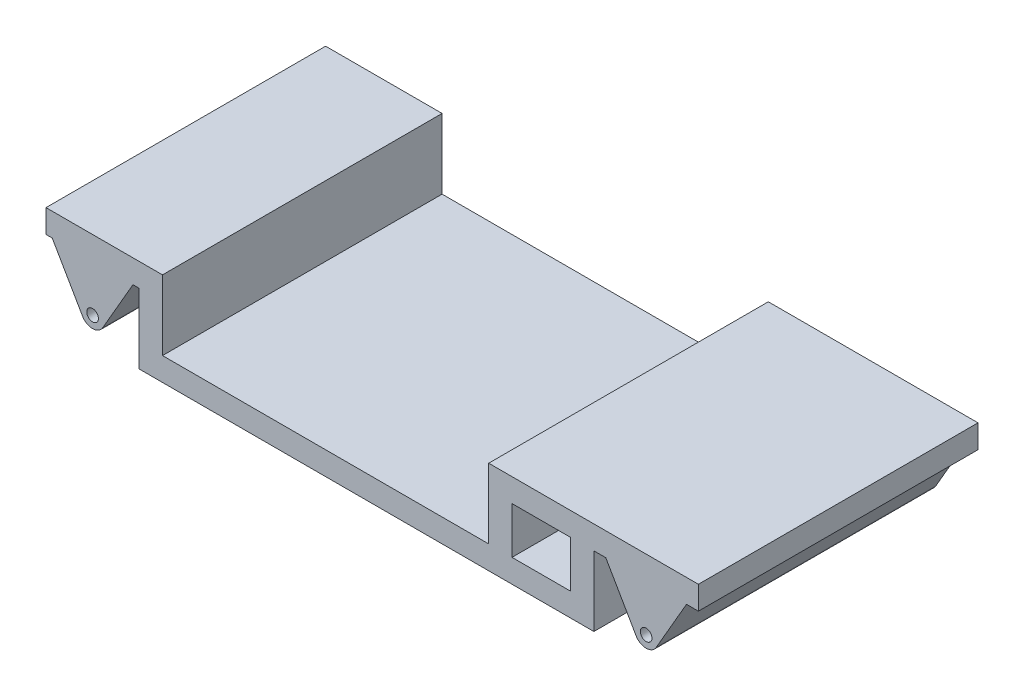
ISO-10303-21;
HEADER;
FILE_DESCRIPTION(('STEP AP214'),'2;1');
FILE_NAME('part.step','',(''),(''),'','','');
FILE_SCHEMA(('AUTOMOTIVE_DESIGN { 1 0 10303 214 1 1 1 1 }'));
ENDSEC;
DATA;
#1=APPLICATION_CONTEXT('core data for automotive mechanical design processes');
#2=APPLICATION_PROTOCOL_DEFINITION('international standard','automotive_design',2000,#1);
#3=PRODUCT_CONTEXT('',#1,'mechanical');
#4=PRODUCT('Part','Part','',(#3));
#5=PRODUCT_RELATED_PRODUCT_CATEGORY('part','',(#4));
#6=PRODUCT_DEFINITION_FORMATION('','',#4);
#7=PRODUCT_DEFINITION_CONTEXT('part definition',#1,'design');
#8=PRODUCT_DEFINITION('design','',#6,#7);
#9=PRODUCT_DEFINITION_SHAPE('','',#8);
#10=(LENGTH_UNIT() NAMED_UNIT(*) SI_UNIT(.MILLI.,.METRE.));
#11=(NAMED_UNIT(*) PLANE_ANGLE_UNIT() SI_UNIT($,.RADIAN.));
#12=(NAMED_UNIT(*) SI_UNIT($,.STERADIAN.) SOLID_ANGLE_UNIT());
#13=UNCERTAINTY_MEASURE_WITH_UNIT(LENGTH_MEASURE(1.E-05),#10,'distance_accuracy_value','');
#14=(GEOMETRIC_REPRESENTATION_CONTEXT(3) GLOBAL_UNCERTAINTY_ASSIGNED_CONTEXT((#13)) GLOBAL_UNIT_ASSIGNED_CONTEXT((#10,
#11,#12)) REPRESENTATION_CONTEXT('',''));
#15=CARTESIAN_POINT('',(0.,0.,0.));
#16=DIRECTION('',(0.,0.,1.));
#17=DIRECTION('',(1.,0.,0.));
#18=AXIS2_PLACEMENT_3D('',#15,#16,#17);
#19=CARTESIAN_POINT('',(900.,624.902446895675,-1200.));
#20=DIRECTION('',(0.,1.,0.));
#21=DIRECTION('',(0.,0.,1.));
#22=AXIS2_PLACEMENT_3D('',#19,#20,#21);
#23=PLANE('',#22);
#24=DIRECTION('',(-1.,0.,0.));
#25=VECTOR('',#24,1.);
#26=CARTESIAN_POINT('',(900.,624.902446895675,0.));
#27=LINE('',#26,#25);
#28=CARTESIAN_POINT('',(1800.,624.902446895675,0.));
#29=VERTEX_POINT('',#28);
#30=CARTESIAN_POINT('',(900.,624.902446895675,0.));
#31=VERTEX_POINT('',#30);
#32=EDGE_CURVE('E233',#29,#31,#27,.T.);
#33=ORIENTED_EDGE('',*,*,#32,.F.);
#34=DIRECTION('',(0.,0.,1.));
#35=VECTOR('',#34,1.);
#36=CARTESIAN_POINT('',(1800.,624.902446895675,-1200.));
#37=LINE('',#36,#35);
#38=CARTESIAN_POINT('',(1800.,624.902446895675,-1200.));
#39=VERTEX_POINT('',#38);
#40=EDGE_CURVE('E11',#39,#29,#37,.T.);
#41=ORIENTED_EDGE('',*,*,#40,.F.);
#42=DIRECTION('',(-1.,0.,0.));
#43=VECTOR('',#42,1.);
#44=CARTESIAN_POINT('',(900.,624.902446895675,-1200.));
#45=LINE('',#44,#43);
#46=CARTESIAN_POINT('',(900.,624.902446895675,-1200.));
#47=VERTEX_POINT('',#46);
#48=EDGE_CURVE('E237',#39,#47,#45,.T.);
#49=ORIENTED_EDGE('',*,*,#48,.T.);
#50=DIRECTION('',(0.,0.,1.));
#51=VECTOR('',#50,1.);
#52=CARTESIAN_POINT('',(900.,624.902446895675,-1200.));
#53=LINE('',#52,#51);
#54=EDGE_CURVE('E38',#47,#31,#53,.T.);
#55=ORIENTED_EDGE('',*,*,#54,.T.);
#56=EDGE_LOOP('',(#33,#41,#49,#55));
#57=FACE_BOUND('',#56,.T.);
#58=ADVANCED_FACE('F35',(#57),#23,.T.);
#59=CARTESIAN_POINT('',(1800.,524.902446895675,-1200.));
#60=DIRECTION('',(1.,0.,0.));
#61=DIRECTION('',(0.,0.,-1.));
#62=AXIS2_PLACEMENT_3D('',#59,#60,#61);
#63=PLANE('',#62);
#64=DIRECTION('',(0.,1.,0.));
#65=VECTOR('',#64,1.);
#66=CARTESIAN_POINT('',(1800.,524.902446895675,0.));
#67=LINE('',#66,#65);
#68=CARTESIAN_POINT('',(1800.,524.902446895675,0.));
#69=VERTEX_POINT('',#68);
#70=EDGE_CURVE('E241',#69,#29,#67,.T.);
#71=ORIENTED_EDGE('',*,*,#70,.F.);
#72=DIRECTION('',(0.,0.,1.));
#73=VECTOR('',#72,1.);
#74=CARTESIAN_POINT('',(1800.,524.902446895675,-1200.));
#75=LINE('',#74,#73);
#76=CARTESIAN_POINT('',(1800.,524.902446895675,-1200.));
#77=VERTEX_POINT('',#76);
#78=EDGE_CURVE('E43',#77,#69,#75,.T.);
#79=ORIENTED_EDGE('',*,*,#78,.F.);
#80=DIRECTION('',(0.,1.,0.));
#81=VECTOR('',#80,1.);
#82=CARTESIAN_POINT('',(1800.,524.902446895675,-1200.));
#83=LINE('',#82,#81);
#84=EDGE_CURVE('E294',#77,#39,#83,.T.);
#85=ORIENTED_EDGE('',*,*,#84,.T.);
#86=ORIENTED_EDGE('',*,*,#40,.T.);
#87=EDGE_LOOP('',(#71,#79,#85,#86));
#88=FACE_BOUND('',#87,.T.);
#89=ADVANCED_FACE('F402',(#88),#63,.T.);
#90=CARTESIAN_POINT('',(1800.,524.902446895675,-1200.));
#91=DIRECTION('',(0.,-1.,0.));
#92=DIRECTION('',(0.,0.,-1.));
#93=AXIS2_PLACEMENT_3D('',#90,#91,#92);
#94=PLANE('',#93);
#95=DIRECTION('',(1.,0.,0.));
#96=VECTOR('',#95,1.);
#97=CARTESIAN_POINT('',(1800.,524.902446895675,0.));
#98=LINE('',#97,#96);
#99=CARTESIAN_POINT('',(1748.91726134456,524.902446895675,0.));
#100=VERTEX_POINT('',#99);
#101=EDGE_CURVE('E350',#100,#69,#98,.T.);
#102=ORIENTED_EDGE('',*,*,#101,.F.);
#103=DIRECTION('',(0.,0.,1.));
#104=VECTOR('',#103,1.);
#105=CARTESIAN_POINT('',(1748.91726134456,524.902446895675,-1200.));
#106=LINE('',#105,#104);
#107=CARTESIAN_POINT('',(1748.91726134456,524.902446895675,-1200.));
#108=VERTEX_POINT('',#107);
#109=EDGE_CURVE('E356',#108,#100,#106,.T.);
#110=ORIENTED_EDGE('',*,*,#109,.F.);
#111=DIRECTION('',(1.,0.,0.));
#112=VECTOR('',#111,1.);
#113=CARTESIAN_POINT('',(1800.,524.902446895675,-1200.));
#114=LINE('',#113,#112);
#115=EDGE_CURVE('E291',#108,#77,#114,.T.);
#116=ORIENTED_EDGE('',*,*,#115,.T.);
#117=ORIENTED_EDGE('',*,*,#78,.T.);
#118=EDGE_LOOP('',(#102,#110,#116,#117));
#119=FACE_BOUND('',#118,.T.);
#120=ADVANCED_FACE('F469',(#119),#94,.T.);
#121=CARTESIAN_POINT('',(1619.01345077689,299.902446895675,-1200.));
#122=DIRECTION('',(0.866025403784439,-0.5,0.));
#123=DIRECTION('',(0.5,0.866025403784439,0.));
#124=AXIS2_PLACEMENT_3D('',#121,#122,#123);
#125=PLANE('',#124);
#126=DIRECTION('',(0.5,0.866025403784439,0.));
#127=VECTOR('',#126,1.);
#128=CARTESIAN_POINT('',(1619.01345077689,299.902446895675,0.));
#129=LINE('',#128,#127);
#130=CARTESIAN_POINT('',(1619.01345077689,299.902446895675,0.));
#131=VERTEX_POINT('',#130);
#132=EDGE_CURVE('E347',#131,#100,#129,.T.);
#133=ORIENTED_EDGE('',*,*,#132,.F.);
#134=DIRECTION('',(0.,0.,1.));
#135=VECTOR('',#134,1.);
#136=CARTESIAN_POINT('',(1619.01345077689,299.902446895675,-1200.));
#137=LINE('',#136,#135);
#138=CARTESIAN_POINT('',(1619.01345077689,299.902446895675,-1200.));
#139=VERTEX_POINT('',#138);
#140=EDGE_CURVE('E358',#139,#131,#137,.T.);
#141=ORIENTED_EDGE('',*,*,#140,.F.);
#142=DIRECTION('',(0.5,0.866025403784439,0.));
#143=VECTOR('',#142,1.);
#144=CARTESIAN_POINT('',(1619.01345077689,299.902446895675,-1200.));
#145=LINE('',#144,#143);
#146=EDGE_CURVE('E288',#139,#108,#145,.T.);
#147=ORIENTED_EDGE('',*,*,#146,.T.);
#148=ORIENTED_EDGE('',*,*,#109,.T.);
#149=EDGE_LOOP('',(#133,#141,#147,#148));
#150=FACE_BOUND('',#149,.T.);
#151=ADVANCED_FACE('F467',(#150),#125,.T.);
#152=CARTESIAN_POINT('',(1575.71218058767,324.902446895675,-1200.));
#153=DIRECTION('',(0.,0.,1.));
#154=DIRECTION('',(1.,0.,0.));
#155=AXIS2_PLACEMENT_3D('',#152,#153,#154);
#156=CYLINDRICAL_SURFACE('',#155,50.0000000000002);
#157=CARTESIAN_POINT('',(1575.71218058767,324.902446895675,0.));
#158=DIRECTION('',(0.,0.,1.));
#159=DIRECTION('',(1.,0.,0.));
#160=AXIS2_PLACEMENT_3D('',#157,#158,#159);
#161=CIRCLE('',#160,50.0000000000002);
#162=CARTESIAN_POINT('',(1532.41091039845,299.902446895675,0.));
#163=VERTEX_POINT('',#162);
#164=EDGE_CURVE('E344',#163,#131,#161,.T.);
#165=ORIENTED_EDGE('',*,*,#164,.F.);
#166=DIRECTION('',(0.,0.,1.));
#167=VECTOR('',#166,1.);
#168=CARTESIAN_POINT('',(1532.41091039845,299.902446895675,-1200.));
#169=LINE('',#168,#167);
#170=CARTESIAN_POINT('',(1532.41091039845,299.902446895675,-1200.));
#171=VERTEX_POINT('',#170);
#172=EDGE_CURVE('E360',#171,#163,#169,.T.);
#173=ORIENTED_EDGE('',*,*,#172,.F.);
#174=CARTESIAN_POINT('',(1575.71218058767,324.902446895675,-1200.));
#175=DIRECTION('',(0.,0.,1.));
#176=DIRECTION('',(1.,0.,0.));
#177=AXIS2_PLACEMENT_3D('',#174,#175,#176);
#178=CIRCLE('',#177,50.0000000000002);
#179=EDGE_CURVE('E285',#171,#139,#178,.T.);
#180=ORIENTED_EDGE('',*,*,#179,.T.);
#181=ORIENTED_EDGE('',*,*,#140,.T.);
#182=EDGE_LOOP('',(#165,#173,#180,#181));
#183=FACE_BOUND('',#182,.T.);
#184=ADVANCED_FACE('F463',(#183),#156,.T.);
#185=CARTESIAN_POINT('',(1532.41091039845,299.902446895675,-1200.));
#186=DIRECTION('',(-0.866025403784439,-0.5,0.));
#187=DIRECTION('',(0.5,-0.866025403784439,0.));
#188=AXIS2_PLACEMENT_3D('',#185,#186,#187);
#189=PLANE('',#188);
#190=DIRECTION('',(0.5,-0.866025403784439,0.));
#191=VECTOR('',#190,1.);
#192=CARTESIAN_POINT('',(1532.41091039845,299.902446895675,0.));
#193=LINE('',#192,#191);
#194=CARTESIAN_POINT('',(1402.50709983078,524.902446895675,0.));
#195=VERTEX_POINT('',#194);
#196=EDGE_CURVE('E341',#195,#163,#193,.T.);
#197=ORIENTED_EDGE('',*,*,#196,.F.);
#198=DIRECTION('',(0.,0.,1.));
#199=VECTOR('',#198,1.);
#200=CARTESIAN_POINT('',(1402.50709983078,524.902446895675,-1200.));
#201=LINE('',#200,#199);
#202=CARTESIAN_POINT('',(1402.50709983078,524.902446895675,-1200.));
#203=VERTEX_POINT('',#202);
#204=EDGE_CURVE('E362',#203,#195,#201,.T.);
#205=ORIENTED_EDGE('',*,*,#204,.F.);
#206=DIRECTION('',(0.5,-0.866025403784439,0.));
#207=VECTOR('',#206,1.);
#208=CARTESIAN_POINT('',(1532.41091039845,299.902446895675,-1200.));
#209=LINE('',#208,#207);
#210=EDGE_CURVE('E282',#203,#171,#209,.T.);
#211=ORIENTED_EDGE('',*,*,#210,.T.);
#212=ORIENTED_EDGE('',*,*,#172,.T.);
#213=EDGE_LOOP('',(#197,#205,#211,#212));
#214=FACE_BOUND('',#213,.T.);
#215=ADVANCED_FACE('F459',(#214),#189,.T.);
#216=CARTESIAN_POINT('',(1402.50709983078,524.902446895675,-1200.));
#217=DIRECTION('',(0.,-1.,0.));
#218=DIRECTION('',(0.,0.,-1.));
#219=AXIS2_PLACEMENT_3D('',#216,#217,#218);
#220=PLANE('',#219);
#221=DIRECTION('',(1.,0.,0.));
#222=VECTOR('',#221,1.);
#223=CARTESIAN_POINT('',(1402.50709983078,524.902446895675,0.));
#224=LINE('',#223,#222);
#225=CARTESIAN_POINT('',(1351.42436117534,524.902446895675,0.));
#226=VERTEX_POINT('',#225);
#227=EDGE_CURVE('E338',#226,#195,#224,.T.);
#228=ORIENTED_EDGE('',*,*,#227,.F.);
#229=DIRECTION('',(0.,0.,1.));
#230=VECTOR('',#229,1.);
#231=CARTESIAN_POINT('',(1351.42436117534,524.902446895675,-1200.));
#232=LINE('',#231,#230);
#233=CARTESIAN_POINT('',(1351.42436117534,524.902446895675,-1200.));
#234=VERTEX_POINT('',#233);
#235=EDGE_CURVE('E364',#234,#226,#232,.T.);
#236=ORIENTED_EDGE('',*,*,#235,.F.);
#237=DIRECTION('',(1.,0.,0.));
#238=VECTOR('',#237,1.);
#239=CARTESIAN_POINT('',(1402.50709983078,524.902446895675,-1200.));
#240=LINE('',#239,#238);
#241=EDGE_CURVE('E279',#234,#203,#240,.T.);
#242=ORIENTED_EDGE('',*,*,#241,.T.);
#243=ORIENTED_EDGE('',*,*,#204,.T.);
#244=EDGE_LOOP('',(#228,#236,#242,#243));
#245=FACE_BOUND('',#244,.T.);
#246=ADVANCED_FACE('F455',(#245),#220,.T.);
#247=CARTESIAN_POINT('',(1351.42436117534,224.902446895675,-1200.));
#248=DIRECTION('',(1.,0.,0.));
#249=DIRECTION('',(0.,0.,-1.));
#250=AXIS2_PLACEMENT_3D('',#247,#248,#249);
#251=PLANE('',#250);
#252=DIRECTION('',(0.,1.,0.));
#253=VECTOR('',#252,1.);
#254=CARTESIAN_POINT('',(1351.42436117534,224.902446895675,0.));
#255=LINE('',#254,#253);
#256=CARTESIAN_POINT('',(1351.42436117534,224.902446895675,0.));
#257=VERTEX_POINT('',#256);
#258=EDGE_CURVE('E335',#257,#226,#255,.T.);
#259=ORIENTED_EDGE('',*,*,#258,.F.);
#260=DIRECTION('',(0.,0.,1.));
#261=VECTOR('',#260,1.);
#262=CARTESIAN_POINT('',(1351.42436117534,224.902446895675,-1200.));
#263=LINE('',#262,#261);
#264=CARTESIAN_POINT('',(1351.42436117534,224.902446895675,-1200.));
#265=VERTEX_POINT('',#264);
#266=EDGE_CURVE('E366',#265,#257,#263,.T.);
#267=ORIENTED_EDGE('',*,*,#266,.F.);
#268=DIRECTION('',(0.,1.,0.));
#269=VECTOR('',#268,1.);
#270=CARTESIAN_POINT('',(1351.42436117534,224.902446895675,-1200.));
#271=LINE('',#270,#269);
#272=EDGE_CURVE('E276',#265,#234,#271,.T.);
#273=ORIENTED_EDGE('',*,*,#272,.T.);
#274=ORIENTED_EDGE('',*,*,#235,.T.);
#275=EDGE_LOOP('',(#259,#267,#273,#274));
#276=FACE_BOUND('',#275,.T.);
#277=ADVANCED_FACE('F451',(#276),#251,.T.);
#278=CARTESIAN_POINT('',(1200.,224.902446895675,-1200.));
#279=DIRECTION('',(0.,-1.,0.));
#280=DIRECTION('',(0.,0.,-1.));
#281=AXIS2_PLACEMENT_3D('',#278,#279,#280);
#282=PLANE('',#281);
#283=DIRECTION('',(1.,0.,0.));
#284=VECTOR('',#283,1.);
#285=CARTESIAN_POINT('',(1200.,224.902446895675,0.));
#286=LINE('',#285,#284);
#287=CARTESIAN_POINT('',(-600.,224.902446895675,0.));
#288=VERTEX_POINT('',#287);
#289=EDGE_CURVE('E332',#288,#257,#286,.T.);
#290=ORIENTED_EDGE('',*,*,#289,.F.);
#291=DIRECTION('',(0.,0.,1.));
#292=VECTOR('',#291,1.);
#293=CARTESIAN_POINT('',(-600.,224.902446895675,-1200.));
#294=LINE('',#293,#292);
#295=CARTESIAN_POINT('',(-600.,224.902446895675,-1200.));
#296=VERTEX_POINT('',#295);
#297=EDGE_CURVE('E368',#296,#288,#294,.T.);
#298=ORIENTED_EDGE('',*,*,#297,.F.);
#299=DIRECTION('',(1.,0.,0.));
#300=VECTOR('',#299,1.);
#301=CARTESIAN_POINT('',(-600.,224.902446895675,-1200.));
#302=LINE('',#301,#300);
#303=EDGE_CURVE('E274',#296,#265,#302,.T.);
#304=ORIENTED_EDGE('',*,*,#303,.T.);
#305=ORIENTED_EDGE('',*,*,#266,.T.);
#306=EDGE_LOOP('',(#290,#298,#304,#305));
#307=FACE_BOUND('',#306,.T.);
#308=ADVANCED_FACE('F446',(#307),#282,.T.);
#309=CARTESIAN_POINT('',(-600.,224.902446895675,-1200.));
#310=DIRECTION('',(-1.,0.,0.));
#311=DIRECTION('',(0.,0.,1.));
#312=AXIS2_PLACEMENT_3D('',#309,#310,#311);
#313=PLANE('',#312);
#314=DIRECTION('',(0.,-1.,0.));
#315=VECTOR('',#314,1.);
#316=CARTESIAN_POINT('',(-600.,224.902446895675,0.));
#317=LINE('',#316,#315);
#318=CARTESIAN_POINT('',(-600.,524.902446895675,0.));
#319=VERTEX_POINT('',#318);
#320=EDGE_CURVE('E329',#319,#288,#317,.T.);
#321=ORIENTED_EDGE('',*,*,#320,.F.);
#322=DIRECTION('',(0.,0.,1.));
#323=VECTOR('',#322,1.);
#324=CARTESIAN_POINT('',(-600.,524.902446895675,-1200.));
#325=LINE('',#324,#323);
#326=CARTESIAN_POINT('',(-600.,524.902446895675,-1200.));
#327=VERTEX_POINT('',#326);
#328=EDGE_CURVE('E371',#327,#319,#325,.T.);
#329=ORIENTED_EDGE('',*,*,#328,.F.);
#330=DIRECTION('',(0.,-1.,0.));
#331=VECTOR('',#330,1.);
#332=CARTESIAN_POINT('',(-600.,224.902446895675,-1200.));
#333=LINE('',#332,#331);
#334=EDGE_CURVE('E271',#327,#296,#333,.T.);
#335=ORIENTED_EDGE('',*,*,#334,.T.);
#336=ORIENTED_EDGE('',*,*,#297,.T.);
#337=EDGE_LOOP('',(#321,#329,#335,#336));
#338=FACE_BOUND('',#337,.T.);
#339=ADVANCED_FACE('F443',(#338),#313,.T.);
#340=CARTESIAN_POINT('',(-600.,524.902446895675,-1200.));
#341=DIRECTION('',(0.,-1.,0.));
#342=DIRECTION('',(0.,0.,-1.));
#343=AXIS2_PLACEMENT_3D('',#340,#341,#342);
#344=PLANE('',#343);
#345=DIRECTION('',(1.,0.,0.));
#346=VECTOR('',#345,1.);
#347=CARTESIAN_POINT('',(-600.,524.902446895675,0.));
#348=LINE('',#347,#346);
#349=CARTESIAN_POINT('',(-626.794919243113,524.902446895675,0.));
#350=VERTEX_POINT('',#349);
#351=EDGE_CURVE('E326',#350,#319,#348,.T.);
#352=ORIENTED_EDGE('',*,*,#351,.F.);
#353=DIRECTION('',(0.,0.,1.));
#354=VECTOR('',#353,1.);
#355=CARTESIAN_POINT('',(-626.794919243113,524.902446895675,-1200.));
#356=LINE('',#355,#354);
#357=CARTESIAN_POINT('',(-626.794919243113,524.902446895675,-1200.));
#358=VERTEX_POINT('',#357);
#359=EDGE_CURVE('E373',#358,#350,#356,.T.);
#360=ORIENTED_EDGE('',*,*,#359,.F.);
#361=DIRECTION('',(1.,0.,0.));
#362=VECTOR('',#361,1.);
#363=CARTESIAN_POINT('',(-600.,524.902446895675,-1200.));
#364=LINE('',#363,#362);
#365=EDGE_CURVE('E268',#358,#327,#364,.T.);
#366=ORIENTED_EDGE('',*,*,#365,.T.);
#367=ORIENTED_EDGE('',*,*,#328,.T.);
#368=EDGE_LOOP('',(#352,#360,#366,#367));
#369=FACE_BOUND('',#368,.T.);
#370=ADVANCED_FACE('F439',(#369),#344,.T.);
#371=CARTESIAN_POINT('',(-756.698729810778,299.902446895675,-1200.));
#372=DIRECTION('',(0.86602540378444,-0.499999999999998,0.));
#373=DIRECTION('',(0.499999999999998,0.86602540378444,0.));
#374=AXIS2_PLACEMENT_3D('',#371,#372,#373);
#375=PLANE('',#374);
#376=DIRECTION('',(0.499999999999998,0.86602540378444,0.));
#377=VECTOR('',#376,1.);
#378=CARTESIAN_POINT('',(-756.698729810778,299.902446895675,0.));
#379=LINE('',#378,#377);
#380=CARTESIAN_POINT('',(-756.698729810778,299.902446895675,0.));
#381=VERTEX_POINT('',#380);
#382=EDGE_CURVE('E323',#381,#350,#379,.T.);
#383=ORIENTED_EDGE('',*,*,#382,.F.);
#384=DIRECTION('',(0.,0.,1.));
#385=VECTOR('',#384,1.);
#386=CARTESIAN_POINT('',(-756.698729810778,299.902446895675,-1200.));
#387=LINE('',#386,#385);
#388=CARTESIAN_POINT('',(-756.698729810778,299.902446895675,-1200.));
#389=VERTEX_POINT('',#388);
#390=EDGE_CURVE('E375',#389,#381,#387,.T.);
#391=ORIENTED_EDGE('',*,*,#390,.F.);
#392=DIRECTION('',(0.499999999999998,0.86602540378444,0.));
#393=VECTOR('',#392,1.);
#394=CARTESIAN_POINT('',(-756.698729810778,299.902446895675,-1200.));
#395=LINE('',#394,#393);
#396=EDGE_CURVE('E265',#389,#358,#395,.T.);
#397=ORIENTED_EDGE('',*,*,#396,.T.);
#398=ORIENTED_EDGE('',*,*,#359,.T.);
#399=EDGE_LOOP('',(#383,#391,#397,#398));
#400=FACE_BOUND('',#399,.T.);
#401=ADVANCED_FACE('F435',(#400),#375,.T.);
#402=CARTESIAN_POINT('',(-800.,324.902446895675,-1200.));
#403=DIRECTION('',(0.,0.,1.));
#404=DIRECTION('',(1.,0.,0.));
#405=AXIS2_PLACEMENT_3D('',#402,#403,#404);
#406=CYLINDRICAL_SURFACE('',#405,50.);
#407=CARTESIAN_POINT('',(-800.,324.902446895675,0.));
#408=DIRECTION('',(0.,0.,1.));
#409=DIRECTION('',(1.,0.,0.));
#410=AXIS2_PLACEMENT_3D('',#407,#408,#409);
#411=CIRCLE('',#410,50.);
#412=CARTESIAN_POINT('',(-843.301270189222,299.902446895675,0.));
#413=VERTEX_POINT('',#412);
#414=EDGE_CURVE('E320',#413,#381,#411,.T.);
#415=ORIENTED_EDGE('',*,*,#414,.F.);
#416=DIRECTION('',(0.,0.,1.));
#417=VECTOR('',#416,1.);
#418=CARTESIAN_POINT('',(-843.301270189222,299.902446895675,-1200.));
#419=LINE('',#418,#417);
#420=CARTESIAN_POINT('',(-843.301270189222,299.902446895675,-1200.));
#421=VERTEX_POINT('',#420);
#422=EDGE_CURVE('E377',#421,#413,#419,.T.);
#423=ORIENTED_EDGE('',*,*,#422,.F.);
#424=CARTESIAN_POINT('',(-800.,324.902446895675,-1200.));
#425=DIRECTION('',(0.,0.,1.));
#426=DIRECTION('',(1.,0.,0.));
#427=AXIS2_PLACEMENT_3D('',#424,#425,#426);
#428=CIRCLE('',#427,50.);
#429=EDGE_CURVE('E262',#421,#389,#428,.T.);
#430=ORIENTED_EDGE('',*,*,#429,.T.);
#431=ORIENTED_EDGE('',*,*,#390,.T.);
#432=EDGE_LOOP('',(#415,#423,#430,#431));
#433=FACE_BOUND('',#432,.T.);
#434=ADVANCED_FACE('F431',(#433),#406,.T.);
#435=CARTESIAN_POINT('',(-843.301270189222,299.902446895675,-1200.));
#436=DIRECTION('',(-0.86602540378444,-0.499999999999998,0.));
#437=DIRECTION('',(0.499999999999998,-0.86602540378444,0.));
#438=AXIS2_PLACEMENT_3D('',#435,#436,#437);
#439=PLANE('',#438);
#440=DIRECTION('',(0.499999999999998,-0.86602540378444,0.));
#441=VECTOR('',#440,1.);
#442=CARTESIAN_POINT('',(-843.301270189222,299.902446895675,0.));
#443=LINE('',#442,#441);
#444=CARTESIAN_POINT('',(-973.205080756887,524.902446895675,0.));
#445=VERTEX_POINT('',#444);
#446=EDGE_CURVE('E317',#445,#413,#443,.T.);
#447=ORIENTED_EDGE('',*,*,#446,.F.);
#448=DIRECTION('',(0.,0.,1.));
#449=VECTOR('',#448,1.);
#450=CARTESIAN_POINT('',(-973.205080756887,524.902446895675,-1200.));
#451=LINE('',#450,#449);
#452=CARTESIAN_POINT('',(-973.205080756887,524.902446895675,-1200.));
#453=VERTEX_POINT('',#452);
#454=EDGE_CURVE('E379',#453,#445,#451,.T.);
#455=ORIENTED_EDGE('',*,*,#454,.F.);
#456=DIRECTION('',(0.499999999999998,-0.86602540378444,0.));
#457=VECTOR('',#456,1.);
#458=CARTESIAN_POINT('',(-843.301270189222,299.902446895675,-1200.));
#459=LINE('',#458,#457);
#460=EDGE_CURVE('E259',#453,#421,#459,.T.);
#461=ORIENTED_EDGE('',*,*,#460,.T.);
#462=ORIENTED_EDGE('',*,*,#422,.T.);
#463=EDGE_LOOP('',(#447,#455,#461,#462));
#464=FACE_BOUND('',#463,.T.);
#465=ADVANCED_FACE('F427',(#464),#439,.T.);
#466=CARTESIAN_POINT('',(-973.205080756887,524.902446895675,-1200.));
#467=DIRECTION('',(0.,-1.,0.));
#468=DIRECTION('',(0.,0.,-1.));
#469=AXIS2_PLACEMENT_3D('',#466,#467,#468);
#470=PLANE('',#469);
#471=DIRECTION('',(1.,0.,0.));
#472=VECTOR('',#471,1.);
#473=CARTESIAN_POINT('',(-973.205080756887,524.902446895675,0.));
#474=LINE('',#473,#472);
#475=CARTESIAN_POINT('',(-1000.,524.902446895675,0.));
#476=VERTEX_POINT('',#475);
#477=EDGE_CURVE('E314',#476,#445,#474,.T.);
#478=ORIENTED_EDGE('',*,*,#477,.F.);
#479=DIRECTION('',(0.,0.,1.));
#480=VECTOR('',#479,1.);
#481=CARTESIAN_POINT('',(-1000.,524.902446895675,-1200.));
#482=LINE('',#481,#480);
#483=CARTESIAN_POINT('',(-1000.,524.902446895675,-1200.));
#484=VERTEX_POINT('',#483);
#485=EDGE_CURVE('E381',#484,#476,#482,.T.);
#486=ORIENTED_EDGE('',*,*,#485,.F.);
#487=DIRECTION('',(1.,0.,0.));
#488=VECTOR('',#487,1.);
#489=CARTESIAN_POINT('',(-973.205080756887,524.902446895675,-1200.));
#490=LINE('',#489,#488);
#491=EDGE_CURVE('E256',#484,#453,#490,.T.);
#492=ORIENTED_EDGE('',*,*,#491,.T.);
#493=ORIENTED_EDGE('',*,*,#454,.T.);
#494=EDGE_LOOP('',(#478,#486,#492,#493));
#495=FACE_BOUND('',#494,.T.);
#496=ADVANCED_FACE('F423',(#495),#470,.T.);
#497=CARTESIAN_POINT('',(-1000.,524.902446895675,-1200.));
#498=DIRECTION('',(-1.,0.,0.));
#499=DIRECTION('',(0.,0.,1.));
#500=AXIS2_PLACEMENT_3D('',#497,#498,#499);
#501=PLANE('',#500);
#502=DIRECTION('',(0.,-1.,0.));
#503=VECTOR('',#502,1.);
#504=CARTESIAN_POINT('',(-1000.,524.902446895675,0.));
#505=LINE('',#504,#503);
#506=CARTESIAN_POINT('',(-1000.,624.902446895675,0.));
#507=VERTEX_POINT('',#506);
#508=EDGE_CURVE('E311',#507,#476,#505,.T.);
#509=ORIENTED_EDGE('',*,*,#508,.F.);
#510=DIRECTION('',(0.,0.,1.));
#511=VECTOR('',#510,1.);
#512=CARTESIAN_POINT('',(-1000.,624.902446895675,-1200.));
#513=LINE('',#512,#511);
#514=CARTESIAN_POINT('',(-1000.,624.902446895675,-1200.));
#515=VERTEX_POINT('',#514);
#516=EDGE_CURVE('E383',#515,#507,#513,.T.);
#517=ORIENTED_EDGE('',*,*,#516,.F.);
#518=DIRECTION('',(0.,-1.,0.));
#519=VECTOR('',#518,1.);
#520=CARTESIAN_POINT('',(-1000.,524.902446895675,-1200.));
#521=LINE('',#520,#519);
#522=EDGE_CURVE('E253',#515,#484,#521,.T.);
#523=ORIENTED_EDGE('',*,*,#522,.T.);
#524=ORIENTED_EDGE('',*,*,#485,.T.);
#525=EDGE_LOOP('',(#509,#517,#523,#524));
#526=FACE_BOUND('',#525,.T.);
#527=ADVANCED_FACE('F419',(#526),#501,.T.);
#528=CARTESIAN_POINT('',(-1000.,624.902446895675,-1200.));
#529=DIRECTION('',(0.,1.,0.));
#530=DIRECTION('',(0.,0.,1.));
#531=AXIS2_PLACEMENT_3D('',#528,#529,#530);
#532=PLANE('',#531);
#533=DIRECTION('',(-1.,0.,0.));
#534=VECTOR('',#533,1.);
#535=CARTESIAN_POINT('',(-1000.,624.902446895675,0.));
#536=LINE('',#535,#534);
#537=CARTESIAN_POINT('',(-500.,624.902446895675,0.));
#538=VERTEX_POINT('',#537);
#539=EDGE_CURVE('E308',#538,#507,#536,.T.);
#540=ORIENTED_EDGE('',*,*,#539,.F.);
#541=DIRECTION('',(0.,0.,1.));
#542=VECTOR('',#541,1.);
#543=CARTESIAN_POINT('',(-500.,624.902446895675,-1200.));
#544=LINE('',#543,#542);
#545=CARTESIAN_POINT('',(-500.,624.902446895675,-1200.));
#546=VERTEX_POINT('',#545);
#547=EDGE_CURVE('E385',#546,#538,#544,.T.);
#548=ORIENTED_EDGE('',*,*,#547,.F.);
#549=DIRECTION('',(-1.,0.,0.));
#550=VECTOR('',#549,1.);
#551=CARTESIAN_POINT('',(-1000.,624.902446895675,-1200.));
#552=LINE('',#551,#550);
#553=EDGE_CURVE('E250',#546,#515,#552,.T.);
#554=ORIENTED_EDGE('',*,*,#553,.T.);
#555=ORIENTED_EDGE('',*,*,#516,.T.);
#556=EDGE_LOOP('',(#540,#548,#554,#555));
#557=FACE_BOUND('',#556,.T.);
#558=ADVANCED_FACE('F415',(#557),#532,.T.);
#559=CARTESIAN_POINT('',(-500.,624.902446895675,-1200.));
#560=DIRECTION('',(1.,0.,0.));
#561=DIRECTION('',(0.,1.,0.));
#562=AXIS2_PLACEMENT_3D('',#559,#560,#561);
#563=PLANE('',#562);
#564=DIRECTION('',(0.,1.,0.));
#565=VECTOR('',#564,1.);
#566=CARTESIAN_POINT('',(-500.,624.902446895675,0.));
#567=LINE('',#566,#565);
#568=CARTESIAN_POINT('',(-500.,324.902446895675,0.));
#569=VERTEX_POINT('',#568);
#570=EDGE_CURVE('E305',#569,#538,#567,.T.);
#571=ORIENTED_EDGE('',*,*,#570,.F.);
#572=DIRECTION('',(0.,0.,1.));
#573=VECTOR('',#572,1.);
#574=CARTESIAN_POINT('',(-500.,324.902446895675,-1200.));
#575=LINE('',#574,#573);
#576=CARTESIAN_POINT('',(-500.,324.902446895675,-1200.));
#577=VERTEX_POINT('',#576);
#578=EDGE_CURVE('E387',#577,#569,#575,.T.);
#579=ORIENTED_EDGE('',*,*,#578,.F.);
#580=DIRECTION('',(0.,1.,0.));
#581=VECTOR('',#580,1.);
#582=CARTESIAN_POINT('',(-500.,624.902446895675,-1200.));
#583=LINE('',#582,#581);
#584=EDGE_CURVE('E247',#577,#546,#583,.T.);
#585=ORIENTED_EDGE('',*,*,#584,.T.);
#586=ORIENTED_EDGE('',*,*,#547,.T.);
#587=EDGE_LOOP('',(#571,#579,#585,#586));
#588=FACE_BOUND('',#587,.T.);
#589=ADVANCED_FACE('F413',(#588),#563,.T.);
#590=CARTESIAN_POINT('',(-500.,324.902446895675,-1200.));
#591=DIRECTION('',(0.,1.,0.));
#592=DIRECTION('',(0.,0.,1.));
#593=AXIS2_PLACEMENT_3D('',#590,#591,#592);
#594=PLANE('',#593);
#595=DIRECTION('',(-1.,0.,0.));
#596=VECTOR('',#595,1.);
#597=CARTESIAN_POINT('',(-500.,324.902446895675,0.));
#598=LINE('',#597,#596);
#599=CARTESIAN_POINT('',(900.,324.902446895675,0.));
#600=VERTEX_POINT('',#599);
#601=EDGE_CURVE('E302',#600,#569,#598,.T.);
#602=ORIENTED_EDGE('',*,*,#601,.F.);
#603=DIRECTION('',(0.,0.,1.));
#604=VECTOR('',#603,1.);
#605=CARTESIAN_POINT('',(900.,324.902446895675,-1200.));
#606=LINE('',#605,#604);
#607=CARTESIAN_POINT('',(900.,324.902446895675,-1200.));
#608=VERTEX_POINT('',#607);
#609=EDGE_CURVE('E388',#608,#600,#606,.T.);
#610=ORIENTED_EDGE('',*,*,#609,.F.);
#611=DIRECTION('',(-1.,0.,0.));
#612=VECTOR('',#611,1.);
#613=CARTESIAN_POINT('',(-500.,324.902446895675,-1200.));
#614=LINE('',#613,#612);
#615=EDGE_CURVE('E244',#608,#577,#614,.T.);
#616=ORIENTED_EDGE('',*,*,#615,.T.);
#617=ORIENTED_EDGE('',*,*,#578,.T.);
#618=EDGE_LOOP('',(#602,#610,#616,#617));
#619=FACE_BOUND('',#618,.T.);
#620=ADVANCED_FACE('F409',(#619),#594,.T.);
#621=CARTESIAN_POINT('',(900.,624.902446895675,-1200.));
#622=DIRECTION('',(-1.,0.,0.));
#623=DIRECTION('',(0.,0.,1.));
#624=AXIS2_PLACEMENT_3D('',#621,#622,#623);
#625=PLANE('',#624);
#626=DIRECTION('',(0.,-1.,0.));
#627=VECTOR('',#626,1.);
#628=CARTESIAN_POINT('',(900.,624.902446895675,0.));
#629=LINE('',#628,#627);
#630=EDGE_CURVE('E299',#31,#600,#629,.T.);
#631=ORIENTED_EDGE('',*,*,#630,.F.);
#632=ORIENTED_EDGE('',*,*,#54,.F.);
#633=DIRECTION('',(0.,-1.,0.));
#634=VECTOR('',#633,1.);
#635=CARTESIAN_POINT('',(900.,624.902446895675,-1200.));
#636=LINE('',#635,#634);
#637=EDGE_CURVE('E240',#47,#608,#636,.T.);
#638=ORIENTED_EDGE('',*,*,#637,.T.);
#639=ORIENTED_EDGE('',*,*,#609,.T.);
#640=EDGE_LOOP('',(#631,#632,#638,#639));
#641=FACE_BOUND('',#640,.T.);
#642=ADVANCED_FACE('F396',(#641),#625,.T.);
#643=CARTESIAN_POINT('',(1575.71218058767,324.902446895675,-1200.));
#644=DIRECTION('',(0.,0.,1.));
#645=DIRECTION('',(1.,0.,0.));
#646=AXIS2_PLACEMENT_3D('',#643,#644,#645);
#647=PLANE('',#646);
#648=CARTESIAN_POINT('',(1575.71218058767,324.902446895675,-1200.));
#649=DIRECTION('',(0.,0.,1.));
#650=DIRECTION('',(1.,0.,0.));
#651=AXIS2_PLACEMENT_3D('',#648,#649,#650);
#652=CIRCLE('',#651,25.);
#653=CARTESIAN_POINT('',(1600.71218058767,324.902446895675,-1200.));
#654=VERTEX_POINT('',#653);
#655=EDGE_CURVE('E703',#654,#654,#652,.T.);
#656=ORIENTED_EDGE('',*,*,#655,.T.);
#657=EDGE_LOOP('',(#656));
#658=FACE_BOUND('',#657,.T.);
#659=CARTESIAN_POINT('',(-800.,324.902446895675,-1200.));
#660=DIRECTION('',(0.,0.,1.));
#661=DIRECTION('',(1.,0.,0.));
#662=AXIS2_PLACEMENT_3D('',#659,#660,#661);
#663=CIRCLE('',#662,24.9999999999999);
#664=CARTESIAN_POINT('',(-775.,324.902446895675,-1200.));
#665=VERTEX_POINT('',#664);
#666=EDGE_CURVE('E227',#665,#665,#663,.T.);
#667=ORIENTED_EDGE('',*,*,#666,.T.);
#668=EDGE_LOOP('',(#667));
#669=FACE_BOUND('',#668,.T.);
#670=DIRECTION('',(-1.,0.,0.));
#671=VECTOR('',#670,1.);
#672=CARTESIAN_POINT('',(1251.42436117534,524.902446895675,-1200.));
#673=LINE('',#672,#671);
#674=CARTESIAN_POINT('',(1251.42436117534,524.902446895675,-1200.));
#675=VERTEX_POINT('',#674);
#676=CARTESIAN_POINT('',(1000.,524.902446895675,-1200.));
#677=VERTEX_POINT('',#676);
#678=EDGE_CURVE('E204',#675,#677,#673,.T.);
#679=ORIENTED_EDGE('',*,*,#678,.T.);
#680=DIRECTION('',(0.,-1.,0.));
#681=VECTOR('',#680,1.);
#682=CARTESIAN_POINT('',(1000.,324.902446895675,-1200.));
#683=LINE('',#682,#681);
#684=CARTESIAN_POINT('',(1000.,324.902446895675,-1200.));
#685=VERTEX_POINT('',#684);
#686=EDGE_CURVE('E198',#677,#685,#683,.T.);
#687=ORIENTED_EDGE('',*,*,#686,.T.);
#688=DIRECTION('',(1.,0.,0.));
#689=VECTOR('',#688,1.);
#690=CARTESIAN_POINT('',(1000.,324.902446895675,-1200.));
#691=LINE('',#690,#689);
#692=CARTESIAN_POINT('',(1251.42436117534,324.902446895675,-1200.));
#693=VERTEX_POINT('',#692);
#694=EDGE_CURVE('E207',#685,#693,#691,.T.);
#695=ORIENTED_EDGE('',*,*,#694,.T.);
#696=DIRECTION('',(0.,1.,0.));
#697=VECTOR('',#696,1.);
#698=CARTESIAN_POINT('',(1251.42436117534,324.902446895675,-1200.));
#699=LINE('',#698,#697);
#700=EDGE_CURVE('E51',#693,#675,#699,.T.);
#701=ORIENTED_EDGE('',*,*,#700,.T.);
#702=EDGE_LOOP('',(#679,#687,#695,#701));
#703=FACE_BOUND('',#702,.T.);
#704=ORIENTED_EDGE('',*,*,#48,.F.);
#705=ORIENTED_EDGE('',*,*,#84,.F.);
#706=ORIENTED_EDGE('',*,*,#115,.F.);
#707=ORIENTED_EDGE('',*,*,#146,.F.);
#708=ORIENTED_EDGE('',*,*,#179,.F.);
#709=ORIENTED_EDGE('',*,*,#210,.F.);
#710=ORIENTED_EDGE('',*,*,#241,.F.);
#711=ORIENTED_EDGE('',*,*,#272,.F.);
#712=ORIENTED_EDGE('',*,*,#303,.F.);
#713=ORIENTED_EDGE('',*,*,#334,.F.);
#714=ORIENTED_EDGE('',*,*,#365,.F.);
#715=ORIENTED_EDGE('',*,*,#396,.F.);
#716=ORIENTED_EDGE('',*,*,#429,.F.);
#717=ORIENTED_EDGE('',*,*,#460,.F.);
#718=ORIENTED_EDGE('',*,*,#491,.F.);
#719=ORIENTED_EDGE('',*,*,#522,.F.);
#720=ORIENTED_EDGE('',*,*,#553,.F.);
#721=ORIENTED_EDGE('',*,*,#584,.F.);
#722=ORIENTED_EDGE('',*,*,#615,.F.);
#723=ORIENTED_EDGE('',*,*,#637,.F.);
#724=EDGE_LOOP('',(#704,#705,#706,#707,#708,#709,#710,#711,#712,#713,#714,#715,#716,#717,#718,
#719,#720,#721,#722,#723));
#725=FACE_BOUND('',#724,.T.);
#726=ADVANCED_FACE('F211',(#658,#669,#703,#725),#647,.F.);
#727=CARTESIAN_POINT('',(1575.71218058767,324.902446895675,0.));
#728=DIRECTION('',(0.,0.,1.));
#729=DIRECTION('',(1.,0.,0.));
#730=AXIS2_PLACEMENT_3D('',#727,#728,#729);
#731=PLANE('',#730);
#732=CARTESIAN_POINT('',(1575.71218058767,324.902446895675,0.));
#733=DIRECTION('',(0.,0.,1.));
#734=DIRECTION('',(1.,0.,0.));
#735=AXIS2_PLACEMENT_3D('',#732,#733,#734);
#736=CIRCLE('',#735,25.);
#737=CARTESIAN_POINT('',(1600.71218058767,324.902446895675,0.));
#738=VERTEX_POINT('',#737);
#739=EDGE_CURVE('E706',#738,#738,#736,.T.);
#740=ORIENTED_EDGE('',*,*,#739,.F.);
#741=EDGE_LOOP('',(#740));
#742=FACE_BOUND('',#741,.T.);
#743=CARTESIAN_POINT('',(-800.,324.902446895675,0.));
#744=DIRECTION('',(0.,0.,1.));
#745=DIRECTION('',(1.,0.,0.));
#746=AXIS2_PLACEMENT_3D('',#743,#744,#745);
#747=CIRCLE('',#746,24.9999999999999);
#748=CARTESIAN_POINT('',(-775.,324.902446895675,0.));
#749=VERTEX_POINT('',#748);
#750=EDGE_CURVE('E220',#749,#749,#747,.T.);
#751=ORIENTED_EDGE('',*,*,#750,.F.);
#752=EDGE_LOOP('',(#751));
#753=FACE_BOUND('',#752,.T.);
#754=DIRECTION('',(0.,-1.,0.));
#755=VECTOR('',#754,1.);
#756=CARTESIAN_POINT('',(1000.,324.902446895675,0.));
#757=LINE('',#756,#755);
#758=CARTESIAN_POINT('',(1000.,524.902446895675,0.));
#759=VERTEX_POINT('',#758);
#760=CARTESIAN_POINT('',(1000.,324.902446895675,0.));
#761=VERTEX_POINT('',#760);
#762=EDGE_CURVE('E59',#759,#761,#757,.T.);
#763=ORIENTED_EDGE('',*,*,#762,.F.);
#764=DIRECTION('',(-1.,0.,0.));
#765=VECTOR('',#764,1.);
#766=CARTESIAN_POINT('',(1251.42436117534,524.902446895675,0.));
#767=LINE('',#766,#765);
#768=CARTESIAN_POINT('',(1251.42436117534,524.902446895675,0.));
#769=VERTEX_POINT('',#768);
#770=EDGE_CURVE('E214',#769,#759,#767,.T.);
#771=ORIENTED_EDGE('',*,*,#770,.F.);
#772=DIRECTION('',(0.,1.,0.));
#773=VECTOR('',#772,1.);
#774=CARTESIAN_POINT('',(1251.42436117534,324.902446895675,0.));
#775=LINE('',#774,#773);
#776=CARTESIAN_POINT('',(1251.42436117534,324.902446895675,0.));
#777=VERTEX_POINT('',#776);
#778=EDGE_CURVE('E217',#777,#769,#775,.T.);
#779=ORIENTED_EDGE('',*,*,#778,.F.);
#780=DIRECTION('',(1.,0.,0.));
#781=VECTOR('',#780,1.);
#782=CARTESIAN_POINT('',(1000.,324.902446895675,0.));
#783=LINE('',#782,#781);
#784=EDGE_CURVE('E226',#761,#777,#783,.T.);
#785=ORIENTED_EDGE('',*,*,#784,.F.);
#786=EDGE_LOOP('',(#763,#771,#779,#785));
#787=FACE_BOUND('',#786,.T.);
#788=ORIENTED_EDGE('',*,*,#32,.T.);
#789=ORIENTED_EDGE('',*,*,#630,.T.);
#790=ORIENTED_EDGE('',*,*,#601,.T.);
#791=ORIENTED_EDGE('',*,*,#570,.T.);
#792=ORIENTED_EDGE('',*,*,#539,.T.);
#793=ORIENTED_EDGE('',*,*,#508,.T.);
#794=ORIENTED_EDGE('',*,*,#477,.T.);
#795=ORIENTED_EDGE('',*,*,#446,.T.);
#796=ORIENTED_EDGE('',*,*,#414,.T.);
#797=ORIENTED_EDGE('',*,*,#382,.T.);
#798=ORIENTED_EDGE('',*,*,#351,.T.);
#799=ORIENTED_EDGE('',*,*,#320,.T.);
#800=ORIENTED_EDGE('',*,*,#289,.T.);
#801=ORIENTED_EDGE('',*,*,#258,.T.);
#802=ORIENTED_EDGE('',*,*,#227,.T.);
#803=ORIENTED_EDGE('',*,*,#196,.T.);
#804=ORIENTED_EDGE('',*,*,#164,.T.);
#805=ORIENTED_EDGE('',*,*,#132,.T.);
#806=ORIENTED_EDGE('',*,*,#101,.T.);
#807=ORIENTED_EDGE('',*,*,#70,.T.);
#808=EDGE_LOOP('',(#788,#789,#790,#791,#792,#793,#794,#795,#796,#797,#798,#799,#800,#801,#802,
#803,#804,#805,#806,#807));
#809=FACE_BOUND('',#808,.T.);
#810=ADVANCED_FACE('F398',(#742,#753,#787,#809),#731,.T.);
#811=CARTESIAN_POINT('',(1000.,324.902446895675,-1200.));
#812=DIRECTION('',(-1.,0.,0.));
#813=DIRECTION('',(0.,0.,1.));
#814=AXIS2_PLACEMENT_3D('',#811,#812,#813);
#815=PLANE('',#814);
#816=ORIENTED_EDGE('',*,*,#762,.T.);
#817=DIRECTION('',(0.,0.,1.));
#818=VECTOR('',#817,1.);
#819=CARTESIAN_POINT('',(1000.,324.902446895675,-1200.));
#820=LINE('',#819,#818);
#821=EDGE_CURVE('E194',#685,#761,#820,.T.);
#822=ORIENTED_EDGE('',*,*,#821,.F.);
#823=ORIENTED_EDGE('',*,*,#686,.F.);
#824=DIRECTION('',(0.,0.,1.));
#825=VECTOR('',#824,1.);
#826=CARTESIAN_POINT('',(1000.,524.902446895675,-1200.));
#827=LINE('',#826,#825);
#828=EDGE_CURVE('E231',#677,#759,#827,.T.);
#829=ORIENTED_EDGE('',*,*,#828,.T.);
#830=EDGE_LOOP('',(#816,#822,#823,#829));
#831=FACE_BOUND('',#830,.T.);
#832=ADVANCED_FACE('F196',(#831),#815,.F.);
#833=CARTESIAN_POINT('',(1251.42436117534,524.902446895675,-1200.));
#834=DIRECTION('',(0.,1.,0.));
#835=DIRECTION('',(0.,0.,1.));
#836=AXIS2_PLACEMENT_3D('',#833,#834,#835);
#837=PLANE('',#836);
#838=ORIENTED_EDGE('',*,*,#770,.T.);
#839=ORIENTED_EDGE('',*,*,#828,.F.);
#840=ORIENTED_EDGE('',*,*,#678,.F.);
#841=DIRECTION('',(0.,0.,1.));
#842=VECTOR('',#841,1.);
#843=CARTESIAN_POINT('',(1251.42436117534,524.902446895675,-1200.));
#844=LINE('',#843,#842);
#845=EDGE_CURVE('E234',#675,#769,#844,.T.);
#846=ORIENTED_EDGE('',*,*,#845,.T.);
#847=EDGE_LOOP('',(#838,#839,#840,#846));
#848=FACE_BOUND('',#847,.T.);
#849=ADVANCED_FACE('F650',(#848),#837,.F.);
#850=CARTESIAN_POINT('',(1251.42436117534,324.902446895675,-1200.));
#851=DIRECTION('',(1.,0.,0.));
#852=DIRECTION('',(0.,0.,-1.));
#853=AXIS2_PLACEMENT_3D('',#850,#851,#852);
#854=PLANE('',#853);
#855=ORIENTED_EDGE('',*,*,#778,.T.);
#856=ORIENTED_EDGE('',*,*,#845,.F.);
#857=ORIENTED_EDGE('',*,*,#700,.F.);
#858=DIRECTION('',(0.,0.,1.));
#859=VECTOR('',#858,1.);
#860=CARTESIAN_POINT('',(1251.42436117534,324.902446895675,-1200.));
#861=LINE('',#860,#859);
#862=EDGE_CURVE('E203',#693,#777,#861,.T.);
#863=ORIENTED_EDGE('',*,*,#862,.T.);
#864=EDGE_LOOP('',(#855,#856,#857,#863));
#865=FACE_BOUND('',#864,.T.);
#866=ADVANCED_FACE('F659',(#865),#854,.F.);
#867=CARTESIAN_POINT('',(1000.,324.902446895675,-1200.));
#868=DIRECTION('',(0.,-1.,0.));
#869=DIRECTION('',(0.,0.,-1.));
#870=AXIS2_PLACEMENT_3D('',#867,#868,#869);
#871=PLANE('',#870);
#872=ORIENTED_EDGE('',*,*,#784,.T.);
#873=ORIENTED_EDGE('',*,*,#862,.F.);
#874=ORIENTED_EDGE('',*,*,#694,.F.);
#875=ORIENTED_EDGE('',*,*,#821,.T.);
#876=EDGE_LOOP('',(#872,#873,#874,#875));
#877=FACE_BOUND('',#876,.T.);
#878=ADVANCED_FACE('F208',(#877),#871,.F.);
#879=CARTESIAN_POINT('',(-800.,324.902446895675,-1200.));
#880=DIRECTION('',(0.,0.,1.));
#881=DIRECTION('',(1.,0.,0.));
#882=AXIS2_PLACEMENT_3D('',#879,#880,#881);
#883=CYLINDRICAL_SURFACE('',#882,24.9999999999999);
#884=ORIENTED_EDGE('',*,*,#666,.F.);
#885=EDGE_LOOP('',(#884));
#886=FACE_BOUND('',#885,.T.);
#887=ORIENTED_EDGE('',*,*,#750,.T.);
#888=EDGE_LOOP('',(#887));
#889=FACE_BOUND('',#888,.T.);
#890=ADVANCED_FACE('F677',(#886,#889),#883,.F.);
#891=CARTESIAN_POINT('',(1575.71218058767,324.902446895675,-1200.));
#892=DIRECTION('',(0.,0.,1.));
#893=DIRECTION('',(1.,0.,0.));
#894=AXIS2_PLACEMENT_3D('',#891,#892,#893);
#895=CYLINDRICAL_SURFACE('',#894,25.);
#896=ORIENTED_EDGE('',*,*,#655,.F.);
#897=EDGE_LOOP('',(#896));
#898=FACE_BOUND('',#897,.T.);
#899=ORIENTED_EDGE('',*,*,#739,.T.);
#900=EDGE_LOOP('',(#899));
#901=FACE_BOUND('',#900,.T.);
#902=ADVANCED_FACE('F686',(#898,#901),#895,.F.);
#903=CLOSED_SHELL('',(#58,#89,#120,#151,#184,#215,#246,#277,#308,#339,#370,#401,#434,#465,#496,
#527,#558,#589,#620,#642,#726,#810,#832,#849,#866,#878,#890,#902));
#904=MANIFOLD_SOLID_BREP('B2',#903);
#905=ADVANCED_BREP_SHAPE_REPRESENTATION('',(#18,#904),#14);
#906=SHAPE_DEFINITION_REPRESENTATION(#9,#905);
ENDSEC;
END-ISO-10303-21;
